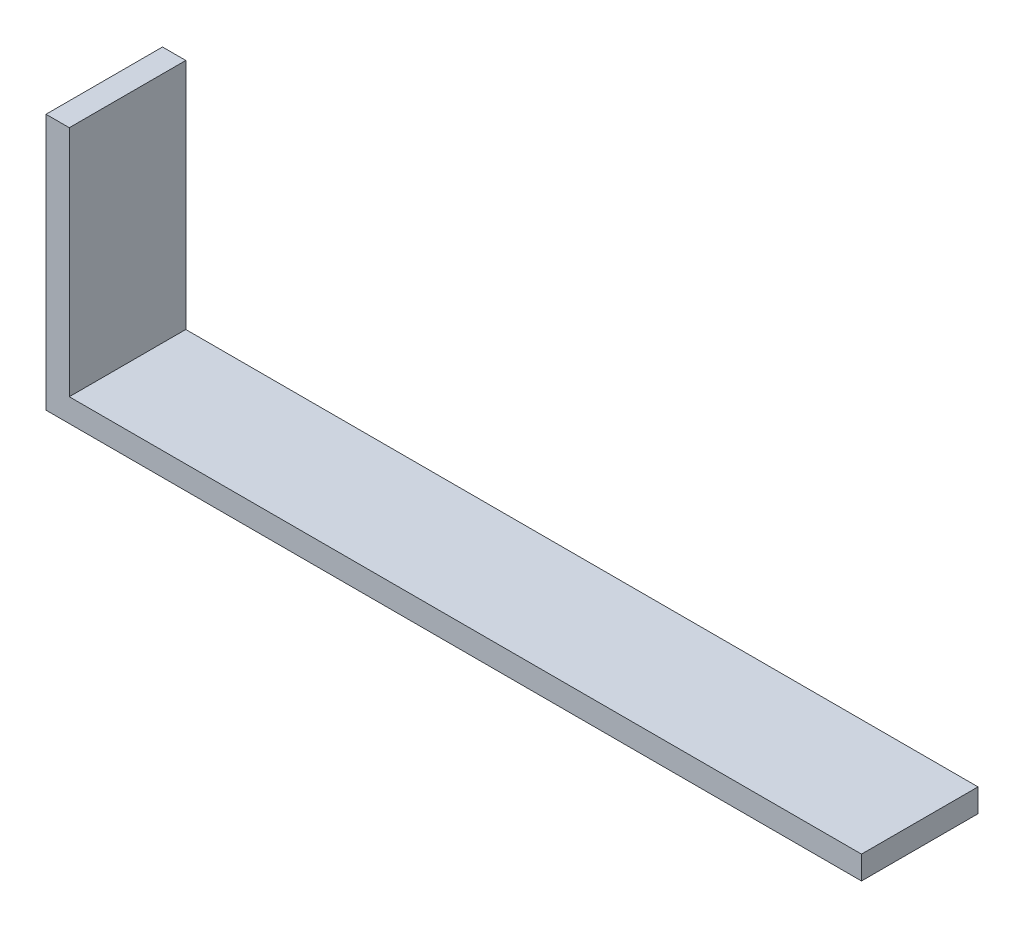
ISO-10303-21;
HEADER;
FILE_DESCRIPTION(('STEP AP214'),'2;1');
FILE_NAME('part.step','',(''),(''),'','','');
FILE_SCHEMA(('AUTOMOTIVE_DESIGN { 1 0 10303 214 1 1 1 1 }'));
ENDSEC;
DATA;
#1=APPLICATION_CONTEXT('core data for automotive mechanical design processes');
#2=APPLICATION_PROTOCOL_DEFINITION('international standard','automotive_design',2000,#1);
#3=PRODUCT_CONTEXT('',#1,'mechanical');
#4=PRODUCT('Part','Part','',(#3));
#5=PRODUCT_RELATED_PRODUCT_CATEGORY('part','',(#4));
#6=PRODUCT_DEFINITION_FORMATION('','',#4);
#7=PRODUCT_DEFINITION_CONTEXT('part definition',#1,'design');
#8=PRODUCT_DEFINITION('design','',#6,#7);
#9=PRODUCT_DEFINITION_SHAPE('','',#8);
#10=(LENGTH_UNIT() NAMED_UNIT(*) SI_UNIT(.MILLI.,.METRE.));
#11=(NAMED_UNIT(*) PLANE_ANGLE_UNIT() SI_UNIT($,.RADIAN.));
#12=(NAMED_UNIT(*) SI_UNIT($,.STERADIAN.) SOLID_ANGLE_UNIT());
#13=UNCERTAINTY_MEASURE_WITH_UNIT(LENGTH_MEASURE(1.E-05),#10,'distance_accuracy_value','');
#14=(GEOMETRIC_REPRESENTATION_CONTEXT(3) GLOBAL_UNCERTAINTY_ASSIGNED_CONTEXT((#13)) GLOBAL_UNIT_ASSIGNED_CONTEXT((#10,
#11,#12)) REPRESENTATION_CONTEXT('',''));
#15=CARTESIAN_POINT('',(0.,0.,0.));
#16=DIRECTION('',(0.,0.,1.));
#17=DIRECTION('',(1.,0.,0.));
#18=AXIS2_PLACEMENT_3D('',#15,#16,#17);
#19=CARTESIAN_POINT('',(1.27,5.98129032258065,6.35));
#20=DIRECTION('',(0.,-1.,0.));
#21=DIRECTION('',(0.,0.,-1.));
#22=AXIS2_PLACEMENT_3D('',#19,#20,#21);
#23=PLANE('',#22);
#24=DIRECTION('',(-1.,0.,0.));
#25=VECTOR('',#24,1.);
#26=CARTESIAN_POINT('',(1.27,5.98129032258065,0.));
#27=LINE('',#26,#25);
#28=CARTESIAN_POINT('',(1.27,5.98129032258065,0.));
#29=VERTEX_POINT('',#28);
#30=CARTESIAN_POINT('',(0.,5.98129032258065,0.));
#31=VERTEX_POINT('',#30);
#32=EDGE_CURVE('E141',#29,#31,#27,.T.);
#33=ORIENTED_EDGE('',*,*,#32,.T.);
#34=DIRECTION('',(0.,0.,-1.));
#35=VECTOR('',#34,1.);
#36=CARTESIAN_POINT('',(0.,5.98129032258065,6.35));
#37=LINE('',#36,#35);
#38=CARTESIAN_POINT('',(0.,5.98129032258065,6.35));
#39=VERTEX_POINT('',#38);
#40=EDGE_CURVE('E11',#39,#31,#37,.T.);
#41=ORIENTED_EDGE('',*,*,#40,.F.);
#42=DIRECTION('',(-1.,0.,0.));
#43=VECTOR('',#42,1.);
#44=CARTESIAN_POINT('',(1.27,5.98129032258065,6.35));
#45=LINE('',#44,#43);
#46=CARTESIAN_POINT('',(1.27,5.98129032258065,6.35));
#47=VERTEX_POINT('',#46);
#48=EDGE_CURVE('E156',#47,#39,#45,.T.);
#49=ORIENTED_EDGE('',*,*,#48,.F.);
#50=DIRECTION('',(0.,0.,-1.));
#51=VECTOR('',#50,1.);
#52=CARTESIAN_POINT('',(1.27,5.98129032258065,6.35));
#53=LINE('',#52,#51);
#54=EDGE_CURVE('E137',#47,#29,#53,.T.);
#55=ORIENTED_EDGE('',*,*,#54,.T.);
#56=EDGE_LOOP('',(#33,#41,#49,#55));
#57=FACE_BOUND('',#56,.T.);
#58=ADVANCED_FACE('F38',(#57),#23,.F.);
#59=CARTESIAN_POINT('',(0.,5.98129032258065,6.35));
#60=DIRECTION('',(1.,0.,0.));
#61=DIRECTION('',(0.,1.,0.));
#62=AXIS2_PLACEMENT_3D('',#59,#60,#61);
#63=PLANE('',#62);
#64=DIRECTION('',(0.,-1.,0.));
#65=VECTOR('',#64,1.);
#66=CARTESIAN_POINT('',(0.,5.98129032258065,0.));
#67=LINE('',#66,#65);
#68=CARTESIAN_POINT('',(0.,-7.98870967741935,0.));
#69=VERTEX_POINT('',#68);
#70=EDGE_CURVE('E144',#31,#69,#67,.T.);
#71=ORIENTED_EDGE('',*,*,#70,.T.);
#72=DIRECTION('',(0.,0.,-1.));
#73=VECTOR('',#72,1.);
#74=CARTESIAN_POINT('',(0.,-7.98870967741935,6.35));
#75=LINE('',#74,#73);
#76=CARTESIAN_POINT('',(0.,-7.98870967741935,6.35));
#77=VERTEX_POINT('',#76);
#78=EDGE_CURVE('E47',#77,#69,#75,.T.);
#79=ORIENTED_EDGE('',*,*,#78,.F.);
#80=DIRECTION('',(0.,-1.,0.));
#81=VECTOR('',#80,1.);
#82=CARTESIAN_POINT('',(0.,5.98129032258065,6.35));
#83=LINE('',#82,#81);
#84=EDGE_CURVE('E103',#39,#77,#83,.T.);
#85=ORIENTED_EDGE('',*,*,#84,.F.);
#86=ORIENTED_EDGE('',*,*,#40,.T.);
#87=EDGE_LOOP('',(#71,#79,#85,#86));
#88=FACE_BOUND('',#87,.T.);
#89=ADVANCED_FACE('F185',(#88),#63,.F.);
#90=CARTESIAN_POINT('',(0.,-7.98870967741935,6.35));
#91=DIRECTION('',(0.,1.,0.));
#92=DIRECTION('',(-1.,0.,0.));
#93=AXIS2_PLACEMENT_3D('',#90,#91,#92);
#94=PLANE('',#93);
#95=DIRECTION('',(1.,0.,0.));
#96=VECTOR('',#95,1.);
#97=CARTESIAN_POINT('',(0.,-7.98870967741935,0.));
#98=LINE('',#97,#96);
#99=CARTESIAN_POINT('',(44.45,-7.98870967741934,0.));
#100=VERTEX_POINT('',#99);
#101=EDGE_CURVE('E147',#69,#100,#98,.T.);
#102=ORIENTED_EDGE('',*,*,#101,.T.);
#103=DIRECTION('',(0.,0.,-1.));
#104=VECTOR('',#103,1.);
#105=CARTESIAN_POINT('',(44.45,-7.98870967741934,6.35));
#106=LINE('',#105,#104);
#107=CARTESIAN_POINT('',(44.45,-7.98870967741934,6.35));
#108=VERTEX_POINT('',#107);
#109=EDGE_CURVE('E128',#108,#100,#106,.T.);
#110=ORIENTED_EDGE('',*,*,#109,.F.);
#111=DIRECTION('',(1.,0.,0.));
#112=VECTOR('',#111,1.);
#113=CARTESIAN_POINT('',(0.,-7.98870967741935,6.35));
#114=LINE('',#113,#112);
#115=EDGE_CURVE('E117',#77,#108,#114,.T.);
#116=ORIENTED_EDGE('',*,*,#115,.F.);
#117=ORIENTED_EDGE('',*,*,#78,.T.);
#118=EDGE_LOOP('',(#102,#110,#116,#117));
#119=FACE_BOUND('',#118,.T.);
#120=ADVANCED_FACE('F167',(#119),#94,.F.);
#121=CARTESIAN_POINT('',(44.45,-7.98870967741934,6.35));
#122=DIRECTION('',(-1.,0.,0.));
#123=DIRECTION('',(0.,0.,1.));
#124=AXIS2_PLACEMENT_3D('',#121,#122,#123);
#125=PLANE('',#124);
#126=DIRECTION('',(0.,1.,0.));
#127=VECTOR('',#126,1.);
#128=CARTESIAN_POINT('',(44.45,-7.98870967741934,0.));
#129=LINE('',#128,#127);
#130=CARTESIAN_POINT('',(44.45,-6.71870967741934,0.));
#131=VERTEX_POINT('',#130);
#132=EDGE_CURVE('E126',#100,#131,#129,.T.);
#133=ORIENTED_EDGE('',*,*,#132,.T.);
#134=DIRECTION('',(0.,0.,-1.));
#135=VECTOR('',#134,1.);
#136=CARTESIAN_POINT('',(44.45,-6.71870967741934,6.35));
#137=LINE('',#136,#135);
#138=CARTESIAN_POINT('',(44.45,-6.71870967741934,6.35));
#139=VERTEX_POINT('',#138);
#140=EDGE_CURVE('E123',#139,#131,#137,.T.);
#141=ORIENTED_EDGE('',*,*,#140,.F.);
#142=DIRECTION('',(0.,1.,0.));
#143=VECTOR('',#142,1.);
#144=CARTESIAN_POINT('',(44.45,-7.98870967741934,6.35));
#145=LINE('',#144,#143);
#146=EDGE_CURVE('E111',#108,#139,#145,.T.);
#147=ORIENTED_EDGE('',*,*,#146,.F.);
#148=ORIENTED_EDGE('',*,*,#109,.T.);
#149=EDGE_LOOP('',(#133,#141,#147,#148));
#150=FACE_BOUND('',#149,.T.);
#151=ADVANCED_FACE('F124',(#150),#125,.F.);
#152=CARTESIAN_POINT('',(44.45,-6.71870967741934,6.35));
#153=DIRECTION('',(0.,-1.,0.));
#154=DIRECTION('',(1.,0.,0.));
#155=AXIS2_PLACEMENT_3D('',#152,#153,#154);
#156=PLANE('',#155);
#157=DIRECTION('',(-1.,0.,0.));
#158=VECTOR('',#157,1.);
#159=CARTESIAN_POINT('',(44.45,-6.71870967741934,0.));
#160=LINE('',#159,#158);
#161=CARTESIAN_POINT('',(1.27,-6.71870967741935,0.));
#162=VERTEX_POINT('',#161);
#163=EDGE_CURVE('E87',#131,#162,#160,.T.);
#164=ORIENTED_EDGE('',*,*,#163,.T.);
#165=DIRECTION('',(0.,0.,-1.));
#166=VECTOR('',#165,1.);
#167=CARTESIAN_POINT('',(1.27,-6.71870967741935,6.35));
#168=LINE('',#167,#166);
#169=CARTESIAN_POINT('',(1.27,-6.71870967741935,6.35));
#170=VERTEX_POINT('',#169);
#171=EDGE_CURVE('E129',#170,#162,#168,.T.);
#172=ORIENTED_EDGE('',*,*,#171,.F.);
#173=DIRECTION('',(-1.,0.,0.));
#174=VECTOR('',#173,1.);
#175=CARTESIAN_POINT('',(44.45,-6.71870967741934,6.35));
#176=LINE('',#175,#174);
#177=EDGE_CURVE('E115',#139,#170,#176,.T.);
#178=ORIENTED_EDGE('',*,*,#177,.F.);
#179=ORIENTED_EDGE('',*,*,#140,.T.);
#180=EDGE_LOOP('',(#164,#172,#178,#179));
#181=FACE_BOUND('',#180,.T.);
#182=ADVANCED_FACE('F131',(#181),#156,.F.);
#183=CARTESIAN_POINT('',(1.27,-6.71870967741935,6.35));
#184=DIRECTION('',(-1.,0.,0.));
#185=DIRECTION('',(0.,-1.,0.));
#186=AXIS2_PLACEMENT_3D('',#183,#184,#185);
#187=PLANE('',#186);
#188=DIRECTION('',(0.,1.,0.));
#189=VECTOR('',#188,1.);
#190=CARTESIAN_POINT('',(1.27,-6.71870967741935,0.));
#191=LINE('',#190,#189);
#192=EDGE_CURVE('E95',#162,#29,#191,.T.);
#193=ORIENTED_EDGE('',*,*,#192,.T.);
#194=ORIENTED_EDGE('',*,*,#54,.F.);
#195=DIRECTION('',(0.,1.,0.));
#196=VECTOR('',#195,1.);
#197=CARTESIAN_POINT('',(1.27,-6.71870967741935,6.35));
#198=LINE('',#197,#196);
#199=EDGE_CURVE('E58',#170,#47,#198,.T.);
#200=ORIENTED_EDGE('',*,*,#199,.F.);
#201=ORIENTED_EDGE('',*,*,#171,.T.);
#202=EDGE_LOOP('',(#193,#194,#200,#201));
#203=FACE_BOUND('',#202,.T.);
#204=ADVANCED_FACE('F174',(#203),#187,.F.);
#205=CARTESIAN_POINT('',(0.,0.,6.35));
#206=DIRECTION('',(0.,0.,1.));
#207=DIRECTION('',(1.,0.,0.));
#208=AXIS2_PLACEMENT_3D('',#205,#206,#207);
#209=PLANE('',#208);
#210=ORIENTED_EDGE('',*,*,#48,.T.);
#211=ORIENTED_EDGE('',*,*,#84,.T.);
#212=ORIENTED_EDGE('',*,*,#115,.T.);
#213=ORIENTED_EDGE('',*,*,#146,.T.);
#214=ORIENTED_EDGE('',*,*,#177,.T.);
#215=ORIENTED_EDGE('',*,*,#199,.T.);
#216=EDGE_LOOP('',(#210,#211,#212,#213,#214,#215));
#217=FACE_BOUND('',#216,.T.);
#218=ADVANCED_FACE('F113',(#217),#209,.T.);
#219=CARTESIAN_POINT('',(0.,0.,0.));
#220=DIRECTION('',(0.,0.,1.));
#221=DIRECTION('',(1.,0.,0.));
#222=AXIS2_PLACEMENT_3D('',#219,#220,#221);
#223=PLANE('',#222);
#224=ORIENTED_EDGE('',*,*,#32,.F.);
#225=ORIENTED_EDGE('',*,*,#192,.F.);
#226=ORIENTED_EDGE('',*,*,#163,.F.);
#227=ORIENTED_EDGE('',*,*,#132,.F.);
#228=ORIENTED_EDGE('',*,*,#101,.F.);
#229=ORIENTED_EDGE('',*,*,#70,.F.);
#230=EDGE_LOOP('',(#224,#225,#226,#227,#228,#229));
#231=FACE_BOUND('',#230,.T.);
#232=ADVANCED_FACE('F170',(#231),#223,.F.);
#233=CLOSED_SHELL('',(#58,#89,#120,#151,#182,#204,#218,#232));
#234=MANIFOLD_SOLID_BREP('B2',#233);
#235=ADVANCED_BREP_SHAPE_REPRESENTATION('',(#18,#234),#14);
#236=SHAPE_DEFINITION_REPRESENTATION(#9,#235);
ENDSEC;
END-ISO-10303-21;
